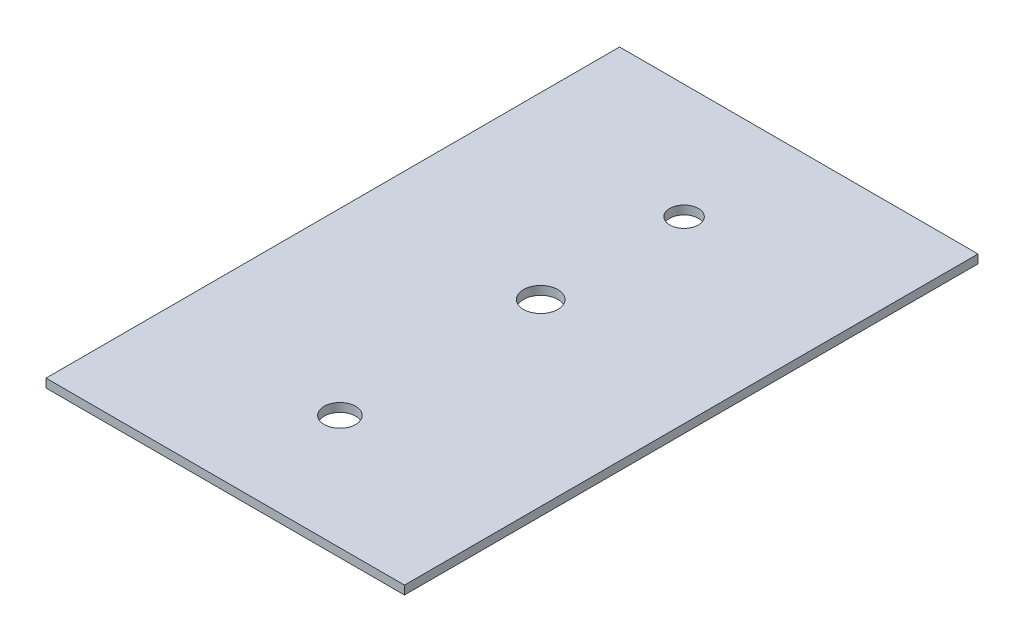
ISO-10303-21;
HEADER;
FILE_DESCRIPTION(('STEP AP214'),'2;1');
FILE_NAME('part.step','',(''),(''),'','','');
FILE_SCHEMA(('AUTOMOTIVE_DESIGN { 1 0 10303 214 1 1 1 1 }'));
ENDSEC;
DATA;
#1=APPLICATION_CONTEXT('core data for automotive mechanical design processes');
#2=APPLICATION_PROTOCOL_DEFINITION('international standard','automotive_design',2000,#1);
#3=PRODUCT_CONTEXT('',#1,'mechanical');
#4=PRODUCT('Part','Part','',(#3));
#5=PRODUCT_RELATED_PRODUCT_CATEGORY('part','',(#4));
#6=PRODUCT_DEFINITION_FORMATION('','',#4);
#7=PRODUCT_DEFINITION_CONTEXT('part definition',#1,'design');
#8=PRODUCT_DEFINITION('design','',#6,#7);
#9=PRODUCT_DEFINITION_SHAPE('','',#8);
#10=(LENGTH_UNIT() NAMED_UNIT(*) SI_UNIT(.MILLI.,.METRE.));
#11=(NAMED_UNIT(*) PLANE_ANGLE_UNIT() SI_UNIT($,.RADIAN.));
#12=(NAMED_UNIT(*) SI_UNIT($,.STERADIAN.) SOLID_ANGLE_UNIT());
#13=UNCERTAINTY_MEASURE_WITH_UNIT(LENGTH_MEASURE(1.E-05),#10,'distance_accuracy_value','');
#14=(GEOMETRIC_REPRESENTATION_CONTEXT(3) GLOBAL_UNCERTAINTY_ASSIGNED_CONTEXT((#13)) GLOBAL_UNIT_ASSIGNED_CONTEXT((#10,
#11,#12)) REPRESENTATION_CONTEXT('',''));
#15=CARTESIAN_POINT('',(0.,0.,0.));
#16=DIRECTION('',(0.,0.,1.));
#17=DIRECTION('',(1.,0.,0.));
#18=AXIS2_PLACEMENT_3D('',#15,#16,#17);
#19=CARTESIAN_POINT('',(62.5,3.,100.));
#20=DIRECTION('',(-1.,0.,0.));
#21=DIRECTION('',(0.,0.,1.));
#22=AXIS2_PLACEMENT_3D('',#19,#20,#21);
#23=PLANE('',#22);
#24=DIRECTION('',(0.,0.,-1.));
#25=VECTOR('',#24,1.);
#26=CARTESIAN_POINT('',(62.5,0.,100.));
#27=LINE('',#26,#25);
#28=CARTESIAN_POINT('',(62.5,0.,100.));
#29=VERTEX_POINT('',#28);
#30=CARTESIAN_POINT('',(62.5,0.,-100.));
#31=VERTEX_POINT('',#30);
#32=EDGE_CURVE('E106',#29,#31,#27,.T.);
#33=ORIENTED_EDGE('',*,*,#32,.T.);
#34=DIRECTION('',(0.,-1.,0.));
#35=VECTOR('',#34,1.);
#36=CARTESIAN_POINT('',(62.5,3.,-100.));
#37=LINE('',#36,#35);
#38=CARTESIAN_POINT('',(62.5,3.,-100.));
#39=VERTEX_POINT('',#38);
#40=EDGE_CURVE('E11',#39,#31,#37,.T.);
#41=ORIENTED_EDGE('',*,*,#40,.F.);
#42=DIRECTION('',(0.,0.,-1.));
#43=VECTOR('',#42,1.);
#44=CARTESIAN_POINT('',(62.5,3.,100.));
#45=LINE('',#44,#43);
#46=CARTESIAN_POINT('',(62.5,3.,100.));
#47=VERTEX_POINT('',#46);
#48=EDGE_CURVE('E90',#47,#39,#45,.T.);
#49=ORIENTED_EDGE('',*,*,#48,.F.);
#50=DIRECTION('',(0.,-1.,0.));
#51=VECTOR('',#50,1.);
#52=CARTESIAN_POINT('',(62.5,3.,100.));
#53=LINE('',#52,#51);
#54=EDGE_CURVE('E102',#47,#29,#53,.T.);
#55=ORIENTED_EDGE('',*,*,#54,.T.);
#56=EDGE_LOOP('',(#33,#41,#49,#55));
#57=FACE_BOUND('',#56,.T.);
#58=ADVANCED_FACE('F38',(#57),#23,.F.);
#59=CARTESIAN_POINT('',(-62.5,3.,-100.));
#60=DIRECTION('',(0.,0.,1.));
#61=DIRECTION('',(1.,0.,0.));
#62=AXIS2_PLACEMENT_3D('',#59,#60,#61);
#63=PLANE('',#62);
#64=DIRECTION('',(-1.,0.,0.));
#65=VECTOR('',#64,1.);
#66=CARTESIAN_POINT('',(-62.5,0.,-100.));
#67=LINE('',#66,#65);
#68=CARTESIAN_POINT('',(-62.5,0.,-100.));
#69=VERTEX_POINT('',#68);
#70=EDGE_CURVE('E95',#31,#69,#67,.T.);
#71=ORIENTED_EDGE('',*,*,#70,.T.);
#72=DIRECTION('',(0.,-1.,0.));
#73=VECTOR('',#72,1.);
#74=CARTESIAN_POINT('',(-62.5,3.,-100.));
#75=LINE('',#74,#73);
#76=CARTESIAN_POINT('',(-62.5,3.,-100.));
#77=VERTEX_POINT('',#76);
#78=EDGE_CURVE('E47',#77,#69,#75,.T.);
#79=ORIENTED_EDGE('',*,*,#78,.F.);
#80=DIRECTION('',(-1.,0.,0.));
#81=VECTOR('',#80,1.);
#82=CARTESIAN_POINT('',(-62.5,3.,-100.));
#83=LINE('',#82,#81);
#84=EDGE_CURVE('E85',#39,#77,#83,.T.);
#85=ORIENTED_EDGE('',*,*,#84,.F.);
#86=ORIENTED_EDGE('',*,*,#40,.T.);
#87=EDGE_LOOP('',(#71,#79,#85,#86));
#88=FACE_BOUND('',#87,.T.);
#89=ADVANCED_FACE('F94',(#88),#63,.F.);
#90=CARTESIAN_POINT('',(-62.5,3.,100.));
#91=DIRECTION('',(1.,0.,0.));
#92=DIRECTION('',(0.,0.,-1.));
#93=AXIS2_PLACEMENT_3D('',#90,#91,#92);
#94=PLANE('',#93);
#95=DIRECTION('',(0.,0.,1.));
#96=VECTOR('',#95,1.);
#97=CARTESIAN_POINT('',(-62.5,0.,100.));
#98=LINE('',#97,#96);
#99=CARTESIAN_POINT('',(-62.5,0.,100.));
#100=VERTEX_POINT('',#99);
#101=EDGE_CURVE('E72',#69,#100,#98,.T.);
#102=ORIENTED_EDGE('',*,*,#101,.T.);
#103=DIRECTION('',(0.,-1.,0.));
#104=VECTOR('',#103,1.);
#105=CARTESIAN_POINT('',(-62.5,3.,100.));
#106=LINE('',#105,#104);
#107=CARTESIAN_POINT('',(-62.5,3.,100.));
#108=VERTEX_POINT('',#107);
#109=EDGE_CURVE('E97',#108,#100,#106,.T.);
#110=ORIENTED_EDGE('',*,*,#109,.F.);
#111=DIRECTION('',(0.,0.,1.));
#112=VECTOR('',#111,1.);
#113=CARTESIAN_POINT('',(-62.5,3.,100.));
#114=LINE('',#113,#112);
#115=EDGE_CURVE('E88',#77,#108,#114,.T.);
#116=ORIENTED_EDGE('',*,*,#115,.F.);
#117=ORIENTED_EDGE('',*,*,#78,.T.);
#118=EDGE_LOOP('',(#102,#110,#116,#117));
#119=FACE_BOUND('',#118,.T.);
#120=ADVANCED_FACE('F98',(#119),#94,.F.);
#121=CARTESIAN_POINT('',(-62.5,3.,100.));
#122=DIRECTION('',(0.,0.,-1.));
#123=DIRECTION('',(-1.,0.,0.));
#124=AXIS2_PLACEMENT_3D('',#121,#122,#123);
#125=PLANE('',#124);
#126=DIRECTION('',(1.,0.,0.));
#127=VECTOR('',#126,1.);
#128=CARTESIAN_POINT('',(-62.5,0.,100.));
#129=LINE('',#128,#127);
#130=EDGE_CURVE('E78',#100,#29,#129,.T.);
#131=ORIENTED_EDGE('',*,*,#130,.T.);
#132=ORIENTED_EDGE('',*,*,#54,.F.);
#133=DIRECTION('',(1.,0.,0.));
#134=VECTOR('',#133,1.);
#135=CARTESIAN_POINT('',(-62.5,3.,100.));
#136=LINE('',#135,#134);
#137=EDGE_CURVE('E55',#108,#47,#136,.T.);
#138=ORIENTED_EDGE('',*,*,#137,.F.);
#139=ORIENTED_EDGE('',*,*,#109,.T.);
#140=EDGE_LOOP('',(#131,#132,#138,#139));
#141=FACE_BOUND('',#140,.T.);
#142=ADVANCED_FACE('F120',(#141),#125,.F.);
#143=CARTESIAN_POINT('',(0.,3.,0.));
#144=DIRECTION('',(0.,-1.,0.));
#145=DIRECTION('',(0.,0.,-1.));
#146=AXIS2_PLACEMENT_3D('',#143,#144,#145);
#147=PLANE('',#146);
#148=CARTESIAN_POINT('',(0.,3.,-60.));
#149=DIRECTION('',(0.,1.,0.));
#150=DIRECTION('',(0.,0.,1.));
#151=AXIS2_PLACEMENT_3D('',#148,#149,#150);
#152=CIRCLE('',#151,5.);
#153=CARTESIAN_POINT('',(0.,3.,-55.));
#154=VERTEX_POINT('',#153);
#155=EDGE_CURVE('E110',#154,#154,#152,.T.);
#156=ORIENTED_EDGE('',*,*,#155,.F.);
#157=EDGE_LOOP('',(#156));
#158=FACE_BOUND('',#157,.T.);
#159=CARTESIAN_POINT('',(0.,3.,60.));
#160=DIRECTION('',(0.,1.,0.));
#161=DIRECTION('',(0.,0.,1.));
#162=AXIS2_PLACEMENT_3D('',#159,#160,#161);
#163=CIRCLE('',#162,5.5);
#164=CARTESIAN_POINT('',(0.,3.,65.5));
#165=VERTEX_POINT('',#164);
#166=EDGE_CURVE('E139',#165,#165,#163,.T.);
#167=ORIENTED_EDGE('',*,*,#166,.F.);
#168=EDGE_LOOP('',(#167));
#169=FACE_BOUND('',#168,.T.);
#170=CARTESIAN_POINT('',(0.,3.,-10.));
#171=DIRECTION('',(0.,1.,0.));
#172=DIRECTION('',(0.,0.,1.));
#173=AXIS2_PLACEMENT_3D('',#170,#171,#172);
#174=CIRCLE('',#173,6.);
#175=CARTESIAN_POINT('',(0.,3.,-4.));
#176=VERTEX_POINT('',#175);
#177=EDGE_CURVE('E131',#176,#176,#174,.T.);
#178=ORIENTED_EDGE('',*,*,#177,.F.);
#179=EDGE_LOOP('',(#178));
#180=FACE_BOUND('',#179,.T.);
#181=ORIENTED_EDGE('',*,*,#48,.T.);
#182=ORIENTED_EDGE('',*,*,#84,.T.);
#183=ORIENTED_EDGE('',*,*,#115,.T.);
#184=ORIENTED_EDGE('',*,*,#137,.T.);
#185=EDGE_LOOP('',(#181,#182,#183,#184));
#186=FACE_BOUND('',#185,.T.);
#187=ADVANCED_FACE('F86',(#158,#169,#180,#186),#147,.F.);
#188=CARTESIAN_POINT('',(0.,0.,0.));
#189=DIRECTION('',(0.,-1.,0.));
#190=DIRECTION('',(0.,0.,-1.));
#191=AXIS2_PLACEMENT_3D('',#188,#189,#190);
#192=PLANE('',#191);
#193=CARTESIAN_POINT('',(0.,0.,-60.));
#194=DIRECTION('',(0.,-1.,0.));
#195=DIRECTION('',(0.,0.,-1.));
#196=AXIS2_PLACEMENT_3D('',#193,#194,#195);
#197=CIRCLE('',#196,5.);
#198=CARTESIAN_POINT('',(0.,0.,-55.));
#199=VERTEX_POINT('',#198);
#200=EDGE_CURVE('E143',#199,#199,#197,.F.);
#201=ORIENTED_EDGE('',*,*,#200,.T.);
#202=EDGE_LOOP('',(#201));
#203=FACE_BOUND('',#202,.T.);
#204=CARTESIAN_POINT('',(0.,0.,60.));
#205=DIRECTION('',(0.,-1.,0.));
#206=DIRECTION('',(0.,0.,-1.));
#207=AXIS2_PLACEMENT_3D('',#204,#205,#206);
#208=CIRCLE('',#207,5.5);
#209=CARTESIAN_POINT('',(0.,0.,65.5));
#210=VERTEX_POINT('',#209);
#211=EDGE_CURVE('E135',#210,#210,#208,.F.);
#212=ORIENTED_EDGE('',*,*,#211,.T.);
#213=EDGE_LOOP('',(#212));
#214=FACE_BOUND('',#213,.T.);
#215=CARTESIAN_POINT('',(0.,0.,-10.));
#216=DIRECTION('',(0.,-1.,0.));
#217=DIRECTION('',(0.,0.,-1.));
#218=AXIS2_PLACEMENT_3D('',#215,#216,#217);
#219=CIRCLE('',#218,6.);
#220=CARTESIAN_POINT('',(0.,0.,-4.));
#221=VERTEX_POINT('',#220);
#222=EDGE_CURVE('E127',#221,#221,#219,.F.);
#223=ORIENTED_EDGE('',*,*,#222,.T.);
#224=EDGE_LOOP('',(#223));
#225=FACE_BOUND('',#224,.T.);
#226=ORIENTED_EDGE('',*,*,#32,.F.);
#227=ORIENTED_EDGE('',*,*,#130,.F.);
#228=ORIENTED_EDGE('',*,*,#101,.F.);
#229=ORIENTED_EDGE('',*,*,#70,.F.);
#230=EDGE_LOOP('',(#226,#227,#228,#229));
#231=FACE_BOUND('',#230,.T.);
#232=ADVANCED_FACE('F123',(#203,#214,#225,#231),#192,.T.);
#233=CARTESIAN_POINT('',(0.,-0.00100000000000013,-10.));
#234=DIRECTION('',(0.,1.,0.));
#235=DIRECTION('',(0.,0.,1.));
#236=AXIS2_PLACEMENT_3D('',#233,#234,#235);
#237=CYLINDRICAL_SURFACE('',#236,6.);
#238=CARTESIAN_POINT('',(0.,0.,-4.));
#239=CARTESIAN_POINT('',(0.,0.03125,-4.));
#240=CARTESIAN_POINT('',(0.,0.0625,-4.));
#241=CARTESIAN_POINT('',(0.,0.125,-4.));
#242=CARTESIAN_POINT('',(0.,0.15625,-4.));
#243=CARTESIAN_POINT('',(0.,0.21875,-4.));
#244=CARTESIAN_POINT('',(0.,0.25,-4.));
#245=CARTESIAN_POINT('',(0.,0.3125,-4.));
#246=CARTESIAN_POINT('',(0.,0.34375,-4.));
#247=CARTESIAN_POINT('',(0.,0.40625,-4.));
#248=CARTESIAN_POINT('',(0.,0.4375,-4.));
#249=CARTESIAN_POINT('',(0.,0.5,-4.));
#250=CARTESIAN_POINT('',(0.,0.53125,-4.));
#251=CARTESIAN_POINT('',(0.,0.59375,-4.));
#252=CARTESIAN_POINT('',(0.,0.625,-4.));
#253=CARTESIAN_POINT('',(0.,0.6875,-4.));
#254=CARTESIAN_POINT('',(0.,0.71875,-4.));
#255=CARTESIAN_POINT('',(0.,0.78125,-4.));
#256=CARTESIAN_POINT('',(0.,0.8125,-4.));
#257=CARTESIAN_POINT('',(0.,0.875,-4.));
#258=CARTESIAN_POINT('',(0.,0.90625,-4.));
#259=CARTESIAN_POINT('',(0.,0.96875,-4.));
#260=CARTESIAN_POINT('',(0.,1.,-4.));
#261=CARTESIAN_POINT('',(0.,1.0625,-4.));
#262=CARTESIAN_POINT('',(0.,1.09375,-4.));
#263=CARTESIAN_POINT('',(0.,1.15625,-4.));
#264=CARTESIAN_POINT('',(0.,1.1875,-4.));
#265=CARTESIAN_POINT('',(0.,1.25,-4.));
#266=CARTESIAN_POINT('',(0.,1.28125,-4.));
#267=CARTESIAN_POINT('',(0.,1.34375,-4.));
#268=CARTESIAN_POINT('',(0.,1.375,-4.));
#269=CARTESIAN_POINT('',(0.,1.4375,-4.));
#270=CARTESIAN_POINT('',(0.,1.46875,-4.));
#271=CARTESIAN_POINT('',(0.,1.53125,-4.));
#272=CARTESIAN_POINT('',(0.,1.5625,-4.));
#273=CARTESIAN_POINT('',(0.,1.625,-4.));
#274=CARTESIAN_POINT('',(0.,1.65625,-4.));
#275=CARTESIAN_POINT('',(0.,1.71875,-4.));
#276=CARTESIAN_POINT('',(0.,1.75,-4.));
#277=CARTESIAN_POINT('',(0.,1.8125,-4.));
#278=CARTESIAN_POINT('',(0.,1.84375,-4.));
#279=CARTESIAN_POINT('',(0.,1.90625,-4.));
#280=CARTESIAN_POINT('',(0.,1.9375,-4.));
#281=CARTESIAN_POINT('',(0.,2.,-4.));
#282=CARTESIAN_POINT('',(0.,2.03125,-4.));
#283=CARTESIAN_POINT('',(0.,2.09375,-4.));
#284=CARTESIAN_POINT('',(0.,2.125,-4.));
#285=CARTESIAN_POINT('',(0.,2.1875,-4.));
#286=CARTESIAN_POINT('',(0.,2.21875,-4.));
#287=CARTESIAN_POINT('',(0.,2.28125,-4.));
#288=CARTESIAN_POINT('',(0.,2.3125,-4.));
#289=CARTESIAN_POINT('',(0.,2.375,-4.));
#290=CARTESIAN_POINT('',(0.,2.40625,-4.));
#291=CARTESIAN_POINT('',(0.,2.46875,-4.));
#292=CARTESIAN_POINT('',(0.,2.5,-4.));
#293=CARTESIAN_POINT('',(0.,2.5625,-4.));
#294=CARTESIAN_POINT('',(0.,2.59375,-4.));
#295=CARTESIAN_POINT('',(0.,2.65625,-4.));
#296=CARTESIAN_POINT('',(0.,2.6875,-4.));
#297=CARTESIAN_POINT('',(0.,2.75,-4.));
#298=CARTESIAN_POINT('',(0.,2.78125,-4.));
#299=CARTESIAN_POINT('',(0.,2.84375,-4.));
#300=CARTESIAN_POINT('',(0.,2.875,-4.));
#301=CARTESIAN_POINT('',(0.,2.9375,-4.));
#302=CARTESIAN_POINT('',(0.,2.96875,-4.));
#303=CARTESIAN_POINT('',(0.,3.,-4.));
#304=B_SPLINE_CURVE_WITH_KNOTS('',3,(#238,#239,#240,#241,#242,#243,#244,#245,#246,#247,#248,
#249,#250,#251,#252,#253,#254,#255,#256,#257,#258,#259,#260,#261,#262,#263,#264,#265,#266,#267,
#268,#269,#270,#271,#272,#273,#274,#275,#276,#277,#278,#279,#280,#281,#282,#283,#284,#285,#286,
#287,#288,#289,#290,#291,#292,#293,#294,#295,#296,#297,#298,#299,#300,#301,#302,#303),
.UNSPECIFIED.,.F.,.F.,(4,2,2,2,2,2,2,2,2,2,2,2,2,2,2,2,2,2,2,2,2,2,2,2,2,2,2,2,2,2,2,2,4),(0.,
0.09375,0.1875,0.28125,0.375,0.46875,0.5625,0.65625,0.75,0.84375,0.9375,1.03125,1.125,1.21875,
1.3125,1.40625,1.5,1.59375,1.6875,1.78125,1.875,1.96875,2.0625,2.15625,2.25,2.34375,2.4375,
2.53125,2.625,2.71875,2.8125,2.90625,3.),.UNSPECIFIED.);
#305=EDGE_CURVE('BSEAM160',#221,#176,#304,.T.);
#306=ORIENTED_EDGE('',*,*,#222,.F.);
#307=ORIENTED_EDGE('',*,*,#177,.T.);
#308=ORIENTED_EDGE('',*,*,#305,.T.);
#309=ORIENTED_EDGE('',*,*,#305,.F.);
#310=EDGE_LOOP('',(#306,#308,#307,#309));
#311=FACE_BOUND('',#310,.T.);
#312=ADVANCED_FACE('F160',(#311),#237,.F.);
#313=CARTESIAN_POINT('',(0.,-0.00100000000000013,60.));
#314=DIRECTION('',(0.,1.,0.));
#315=DIRECTION('',(0.,0.,1.));
#316=AXIS2_PLACEMENT_3D('',#313,#314,#315);
#317=CYLINDRICAL_SURFACE('',#316,5.5);
#318=CARTESIAN_POINT('',(0.,0.,65.5));
#319=CARTESIAN_POINT('',(0.,0.03125,65.5));
#320=CARTESIAN_POINT('',(0.,0.0625,65.5));
#321=CARTESIAN_POINT('',(0.,0.125,65.5));
#322=CARTESIAN_POINT('',(0.,0.15625,65.5));
#323=CARTESIAN_POINT('',(0.,0.21875,65.5));
#324=CARTESIAN_POINT('',(0.,0.25,65.5));
#325=CARTESIAN_POINT('',(0.,0.3125,65.5));
#326=CARTESIAN_POINT('',(0.,0.34375,65.5));
#327=CARTESIAN_POINT('',(0.,0.40625,65.5));
#328=CARTESIAN_POINT('',(0.,0.4375,65.5));
#329=CARTESIAN_POINT('',(0.,0.5,65.5));
#330=CARTESIAN_POINT('',(0.,0.53125,65.5));
#331=CARTESIAN_POINT('',(0.,0.59375,65.5));
#332=CARTESIAN_POINT('',(0.,0.625,65.5));
#333=CARTESIAN_POINT('',(0.,0.6875,65.5));
#334=CARTESIAN_POINT('',(0.,0.71875,65.5));
#335=CARTESIAN_POINT('',(0.,0.78125,65.5));
#336=CARTESIAN_POINT('',(0.,0.8125,65.5));
#337=CARTESIAN_POINT('',(0.,0.875,65.5));
#338=CARTESIAN_POINT('',(0.,0.90625,65.5));
#339=CARTESIAN_POINT('',(0.,0.96875,65.5));
#340=CARTESIAN_POINT('',(0.,1.,65.5));
#341=CARTESIAN_POINT('',(0.,1.0625,65.5));
#342=CARTESIAN_POINT('',(0.,1.09375,65.5));
#343=CARTESIAN_POINT('',(0.,1.15625,65.5));
#344=CARTESIAN_POINT('',(0.,1.1875,65.5));
#345=CARTESIAN_POINT('',(0.,1.25,65.5));
#346=CARTESIAN_POINT('',(0.,1.28125,65.5));
#347=CARTESIAN_POINT('',(0.,1.34375,65.5));
#348=CARTESIAN_POINT('',(0.,1.375,65.5));
#349=CARTESIAN_POINT('',(0.,1.4375,65.5));
#350=CARTESIAN_POINT('',(0.,1.46875,65.5));
#351=CARTESIAN_POINT('',(0.,1.53125,65.5));
#352=CARTESIAN_POINT('',(0.,1.5625,65.5));
#353=CARTESIAN_POINT('',(0.,1.625,65.5));
#354=CARTESIAN_POINT('',(0.,1.65625,65.5));
#355=CARTESIAN_POINT('',(0.,1.71875,65.5));
#356=CARTESIAN_POINT('',(0.,1.75,65.5));
#357=CARTESIAN_POINT('',(0.,1.8125,65.5));
#358=CARTESIAN_POINT('',(0.,1.84375,65.5));
#359=CARTESIAN_POINT('',(0.,1.90625,65.5));
#360=CARTESIAN_POINT('',(0.,1.9375,65.5));
#361=CARTESIAN_POINT('',(0.,2.,65.5));
#362=CARTESIAN_POINT('',(0.,2.03125,65.5));
#363=CARTESIAN_POINT('',(0.,2.09375,65.5));
#364=CARTESIAN_POINT('',(0.,2.125,65.5));
#365=CARTESIAN_POINT('',(0.,2.1875,65.5));
#366=CARTESIAN_POINT('',(0.,2.21875,65.5));
#367=CARTESIAN_POINT('',(0.,2.28125,65.5));
#368=CARTESIAN_POINT('',(0.,2.3125,65.5));
#369=CARTESIAN_POINT('',(0.,2.375,65.5));
#370=CARTESIAN_POINT('',(0.,2.40625,65.5));
#371=CARTESIAN_POINT('',(0.,2.46875,65.5));
#372=CARTESIAN_POINT('',(0.,2.5,65.5));
#373=CARTESIAN_POINT('',(0.,2.5625,65.5));
#374=CARTESIAN_POINT('',(0.,2.59375,65.5));
#375=CARTESIAN_POINT('',(0.,2.65625,65.5));
#376=CARTESIAN_POINT('',(0.,2.6875,65.5));
#377=CARTESIAN_POINT('',(0.,2.75,65.5));
#378=CARTESIAN_POINT('',(0.,2.78125,65.5));
#379=CARTESIAN_POINT('',(0.,2.84375,65.5));
#380=CARTESIAN_POINT('',(0.,2.875,65.5));
#381=CARTESIAN_POINT('',(0.,2.9375,65.5));
#382=CARTESIAN_POINT('',(0.,2.96875,65.5));
#383=CARTESIAN_POINT('',(0.,3.,65.5));
#384=B_SPLINE_CURVE_WITH_KNOTS('',3,(#318,#319,#320,#321,#322,#323,#324,#325,#326,#327,#328,
#329,#330,#331,#332,#333,#334,#335,#336,#337,#338,#339,#340,#341,#342,#343,#344,#345,#346,#347,
#348,#349,#350,#351,#352,#353,#354,#355,#356,#357,#358,#359,#360,#361,#362,#363,#364,#365,#366,
#367,#368,#369,#370,#371,#372,#373,#374,#375,#376,#377,#378,#379,#380,#381,#382,#383),
.UNSPECIFIED.,.F.,.F.,(4,2,2,2,2,2,2,2,2,2,2,2,2,2,2,2,2,2,2,2,2,2,2,2,2,2,2,2,2,2,2,2,4),(0.,
0.09375,0.1875,0.28125,0.375,0.46875,0.5625,0.65625,0.75,0.84375,0.9375,1.03125,1.125,1.21875,
1.3125,1.40625,1.5,1.59375,1.6875,1.78125,1.875,1.96875,2.0625,2.15625,2.25,2.34375,2.4375,
2.53125,2.625,2.71875,2.8125,2.90625,3.),.UNSPECIFIED.);
#385=EDGE_CURVE('BSEAM162',#210,#165,#384,.T.);
#386=ORIENTED_EDGE('',*,*,#211,.F.);
#387=ORIENTED_EDGE('',*,*,#166,.T.);
#388=ORIENTED_EDGE('',*,*,#385,.T.);
#389=ORIENTED_EDGE('',*,*,#385,.F.);
#390=EDGE_LOOP('',(#386,#388,#387,#389));
#391=FACE_BOUND('',#390,.T.);
#392=ADVANCED_FACE('F162',(#391),#317,.F.);
#393=CARTESIAN_POINT('',(0.,-0.00100000000000013,-60.));
#394=DIRECTION('',(0.,1.,0.));
#395=DIRECTION('',(0.,0.,1.));
#396=AXIS2_PLACEMENT_3D('',#393,#394,#395);
#397=CYLINDRICAL_SURFACE('',#396,5.);
#398=CARTESIAN_POINT('',(0.,0.,-55.));
#399=CARTESIAN_POINT('',(0.,0.03125,-55.));
#400=CARTESIAN_POINT('',(0.,0.0625,-55.));
#401=CARTESIAN_POINT('',(0.,0.125,-55.));
#402=CARTESIAN_POINT('',(0.,0.15625,-55.));
#403=CARTESIAN_POINT('',(0.,0.21875,-55.));
#404=CARTESIAN_POINT('',(0.,0.25,-55.));
#405=CARTESIAN_POINT('',(0.,0.3125,-55.));
#406=CARTESIAN_POINT('',(0.,0.34375,-55.));
#407=CARTESIAN_POINT('',(0.,0.40625,-55.));
#408=CARTESIAN_POINT('',(0.,0.4375,-55.));
#409=CARTESIAN_POINT('',(0.,0.5,-55.));
#410=CARTESIAN_POINT('',(0.,0.53125,-55.));
#411=CARTESIAN_POINT('',(0.,0.59375,-55.));
#412=CARTESIAN_POINT('',(0.,0.625,-55.));
#413=CARTESIAN_POINT('',(0.,0.6875,-55.));
#414=CARTESIAN_POINT('',(0.,0.71875,-55.));
#415=CARTESIAN_POINT('',(0.,0.78125,-55.));
#416=CARTESIAN_POINT('',(0.,0.8125,-55.));
#417=CARTESIAN_POINT('',(0.,0.875,-55.));
#418=CARTESIAN_POINT('',(0.,0.90625,-55.));
#419=CARTESIAN_POINT('',(0.,0.96875,-55.));
#420=CARTESIAN_POINT('',(0.,1.,-55.));
#421=CARTESIAN_POINT('',(0.,1.0625,-55.));
#422=CARTESIAN_POINT('',(0.,1.09375,-55.));
#423=CARTESIAN_POINT('',(0.,1.15625,-55.));
#424=CARTESIAN_POINT('',(0.,1.1875,-55.));
#425=CARTESIAN_POINT('',(0.,1.25,-55.));
#426=CARTESIAN_POINT('',(0.,1.28125,-55.));
#427=CARTESIAN_POINT('',(0.,1.34375,-55.));
#428=CARTESIAN_POINT('',(0.,1.375,-55.));
#429=CARTESIAN_POINT('',(0.,1.4375,-55.));
#430=CARTESIAN_POINT('',(0.,1.46875,-55.));
#431=CARTESIAN_POINT('',(0.,1.53125,-55.));
#432=CARTESIAN_POINT('',(0.,1.5625,-55.));
#433=CARTESIAN_POINT('',(0.,1.625,-55.));
#434=CARTESIAN_POINT('',(0.,1.65625,-55.));
#435=CARTESIAN_POINT('',(0.,1.71875,-55.));
#436=CARTESIAN_POINT('',(0.,1.75,-55.));
#437=CARTESIAN_POINT('',(0.,1.8125,-55.));
#438=CARTESIAN_POINT('',(0.,1.84375,-55.));
#439=CARTESIAN_POINT('',(0.,1.90625,-55.));
#440=CARTESIAN_POINT('',(0.,1.9375,-55.));
#441=CARTESIAN_POINT('',(0.,2.,-55.));
#442=CARTESIAN_POINT('',(0.,2.03125,-55.));
#443=CARTESIAN_POINT('',(0.,2.09375,-55.));
#444=CARTESIAN_POINT('',(0.,2.125,-55.));
#445=CARTESIAN_POINT('',(0.,2.1875,-55.));
#446=CARTESIAN_POINT('',(0.,2.21875,-55.));
#447=CARTESIAN_POINT('',(0.,2.28125,-55.));
#448=CARTESIAN_POINT('',(0.,2.3125,-55.));
#449=CARTESIAN_POINT('',(0.,2.375,-55.));
#450=CARTESIAN_POINT('',(0.,2.40625,-55.));
#451=CARTESIAN_POINT('',(0.,2.46875,-55.));
#452=CARTESIAN_POINT('',(0.,2.5,-55.));
#453=CARTESIAN_POINT('',(0.,2.5625,-55.));
#454=CARTESIAN_POINT('',(0.,2.59375,-55.));
#455=CARTESIAN_POINT('',(0.,2.65625,-55.));
#456=CARTESIAN_POINT('',(0.,2.6875,-55.));
#457=CARTESIAN_POINT('',(0.,2.75,-55.));
#458=CARTESIAN_POINT('',(0.,2.78125,-55.));
#459=CARTESIAN_POINT('',(0.,2.84375,-55.));
#460=CARTESIAN_POINT('',(0.,2.875,-55.));
#461=CARTESIAN_POINT('',(0.,2.9375,-55.));
#462=CARTESIAN_POINT('',(0.,2.96875,-55.));
#463=CARTESIAN_POINT('',(0.,3.,-55.));
#464=B_SPLINE_CURVE_WITH_KNOTS('',3,(#398,#399,#400,#401,#402,#403,#404,#405,#406,#407,#408,
#409,#410,#411,#412,#413,#414,#415,#416,#417,#418,#419,#420,#421,#422,#423,#424,#425,#426,#427,
#428,#429,#430,#431,#432,#433,#434,#435,#436,#437,#438,#439,#440,#441,#442,#443,#444,#445,#446,
#447,#448,#449,#450,#451,#452,#453,#454,#455,#456,#457,#458,#459,#460,#461,#462,#463),
.UNSPECIFIED.,.F.,.F.,(4,2,2,2,2,2,2,2,2,2,2,2,2,2,2,2,2,2,2,2,2,2,2,2,2,2,2,2,2,2,2,2,4),(0.,
0.09375,0.1875,0.28125,0.375,0.46875,0.5625,0.65625,0.75,0.84375,0.9375,1.03125,1.125,1.21875,
1.3125,1.40625,1.5,1.59375,1.6875,1.78125,1.875,1.96875,2.0625,2.15625,2.25,2.34375,2.4375,
2.53125,2.625,2.71875,2.8125,2.90625,3.),.UNSPECIFIED.);
#465=EDGE_CURVE('BSEAM151',#199,#154,#464,.T.);
#466=ORIENTED_EDGE('',*,*,#200,.F.);
#467=ORIENTED_EDGE('',*,*,#155,.T.);
#468=ORIENTED_EDGE('',*,*,#465,.T.);
#469=ORIENTED_EDGE('',*,*,#465,.F.);
#470=EDGE_LOOP('',(#466,#468,#467,#469));
#471=FACE_BOUND('',#470,.T.);
#472=ADVANCED_FACE('F151',(#471),#397,.F.);
#473=CLOSED_SHELL('',(#58,#89,#120,#142,#187,#232,#312,#392,#472));
#474=MANIFOLD_SOLID_BREP('B2',#473);
#475=ADVANCED_BREP_SHAPE_REPRESENTATION('',(#18,#474),#14);
#476=SHAPE_DEFINITION_REPRESENTATION(#9,#475);
ENDSEC;
END-ISO-10303-21;
